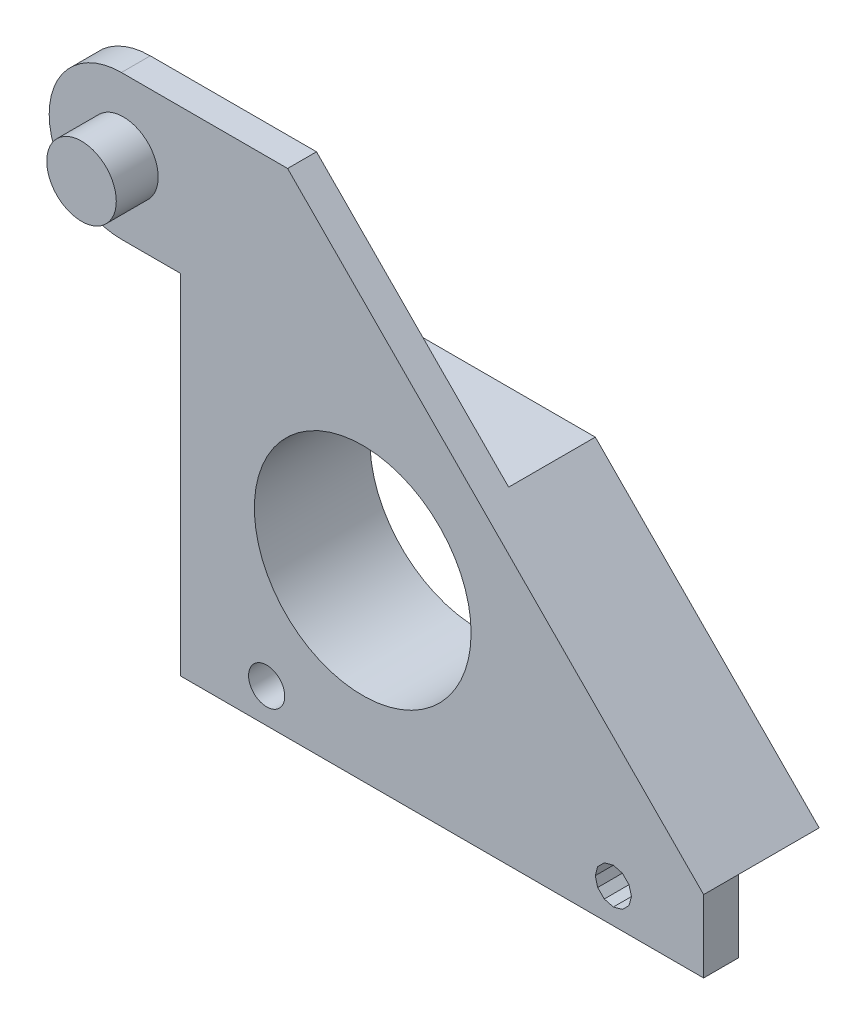
ISO-10303-21;
HEADER;
FILE_DESCRIPTION(('STEP AP214'),'2;1');
FILE_NAME('part.step','',(''),(''),'','','');
FILE_SCHEMA(('AUTOMOTIVE_DESIGN { 1 0 10303 214 1 1 1 1 }'));
ENDSEC;
DATA;
#1=APPLICATION_CONTEXT('core data for automotive mechanical design processes');
#2=APPLICATION_PROTOCOL_DEFINITION('international standard','automotive_design',2000,#1);
#3=PRODUCT_CONTEXT('',#1,'mechanical');
#4=PRODUCT('Part','Part','',(#3));
#5=PRODUCT_RELATED_PRODUCT_CATEGORY('part','',(#4));
#6=PRODUCT_DEFINITION_FORMATION('','',#4);
#7=PRODUCT_DEFINITION_CONTEXT('part definition',#1,'design');
#8=PRODUCT_DEFINITION('design','',#6,#7);
#9=PRODUCT_DEFINITION_SHAPE('','',#8);
#10=(LENGTH_UNIT() NAMED_UNIT(*) SI_UNIT(.MILLI.,.METRE.));
#11=(NAMED_UNIT(*) PLANE_ANGLE_UNIT() SI_UNIT($,.RADIAN.));
#12=(NAMED_UNIT(*) SI_UNIT($,.STERADIAN.) SOLID_ANGLE_UNIT());
#13=UNCERTAINTY_MEASURE_WITH_UNIT(LENGTH_MEASURE(1.E-05),#10,'distance_accuracy_value','');
#14=(GEOMETRIC_REPRESENTATION_CONTEXT(3) GLOBAL_UNCERTAINTY_ASSIGNED_CONTEXT((#13)) GLOBAL_UNIT_ASSIGNED_CONTEXT((#10,
#11,#12)) REPRESENTATION_CONTEXT('',''));
#15=CARTESIAN_POINT('',(0.,0.,0.));
#16=DIRECTION('',(0.,0.,1.));
#17=DIRECTION('',(1.,0.,0.));
#18=AXIS2_PLACEMENT_3D('',#15,#16,#17);
#19=CARTESIAN_POINT('',(-56.2999993562698,-5.49999997019768,0.));
#20=DIRECTION('',(-1.,0.,0.));
#21=DIRECTION('',(0.,0.,1.));
#22=AXIS2_PLACEMENT_3D('',#19,#20,#21);
#23=PLANE('',#22);
#24=DIRECTION('',(0.,0.,-1.));
#25=VECTOR('',#24,1.);
#26=CARTESIAN_POINT('',(-56.2999993562698,-8.95606280006322,0.400000113993883));
#27=LINE('',#26,#25);
#28=CARTESIAN_POINT('',(-56.2999993562698,-8.95606280006322,0.400000113993883));
#29=VERTEX_POINT('',#28);
#30=CARTESIAN_POINT('',(-56.2999993562698,-8.95606280006322,-5.59999988600612));
#31=VERTEX_POINT('',#30);
#32=EDGE_CURVE('E291',#29,#31,#27,.T.);
#33=ORIENTED_EDGE('',*,*,#32,.T.);
#34=DIRECTION('',(0.,-1.,0.));
#35=VECTOR('',#34,1.);
#36=CARTESIAN_POINT('',(-56.2999993562698,-24.6347561478615,-5.59999988600612));
#37=LINE('',#36,#35);
#38=CARTESIAN_POINT('',(-56.2999993562698,-24.6347561478615,-5.59999988600612));
#39=VERTEX_POINT('',#38);
#40=EDGE_CURVE('E285',#31,#39,#37,.T.);
#41=ORIENTED_EDGE('',*,*,#40,.T.);
#42=DIRECTION('',(0.,0.,1.));
#43=VECTOR('',#42,1.);
#44=CARTESIAN_POINT('',(-56.2999993562698,-24.6347561478615,-5.59999988600612));
#45=LINE('',#44,#43);
#46=CARTESIAN_POINT('',(-56.2999993562698,-24.6347561478615,0.));
#47=VERTEX_POINT('',#46);
#48=EDGE_CURVE('E64',#39,#47,#45,.T.);
#49=ORIENTED_EDGE('',*,*,#48,.T.);
#50=DIRECTION('',(0.,-1.,0.));
#51=VECTOR('',#50,1.);
#52=CARTESIAN_POINT('',(-56.2999993562698,-5.49999997019768,0.));
#53=LINE('',#52,#51);
#54=CARTESIAN_POINT('',(-56.2999993562698,-29.6347561478615,0.));
#55=VERTEX_POINT('',#54);
#56=EDGE_CURVE('E225',#47,#55,#53,.T.);
#57=ORIENTED_EDGE('',*,*,#56,.T.);
#58=DIRECTION('',(0.,0.,-1.));
#59=VECTOR('',#58,1.);
#60=CARTESIAN_POINT('',(-56.2999993562698,-29.6347561478615,0.));
#61=LINE('',#60,#59);
#62=CARTESIAN_POINT('',(-56.2999993562698,-29.6347561478615,2.40000011399388));
#63=VERTEX_POINT('',#62);
#64=EDGE_CURVE('E255',#63,#55,#61,.T.);
#65=ORIENTED_EDGE('',*,*,#64,.F.);
#66=DIRECTION('',(0.,-1.,0.));
#67=VECTOR('',#66,1.);
#68=CARTESIAN_POINT('',(-56.2999993562698,-5.49999997019768,2.40000011399388));
#69=LINE('',#68,#67);
#70=CARTESIAN_POINT('',(-56.2999993562698,-5.49999997019768,2.40000011399388));
#71=VERTEX_POINT('',#70);
#72=EDGE_CURVE('E231',#71,#63,#69,.T.);
#73=ORIENTED_EDGE('',*,*,#72,.F.);
#74=DIRECTION('',(0.,0.,1.));
#75=VECTOR('',#74,1.);
#76=CARTESIAN_POINT('',(-56.2999993562698,-5.49999997019768,0.));
#77=LINE('',#76,#75);
#78=CARTESIAN_POINT('',(-56.2999993562698,-5.49999997019768,0.400000113993883));
#79=VERTEX_POINT('',#78);
#80=EDGE_CURVE('E11',#79,#71,#77,.T.);
#81=ORIENTED_EDGE('',*,*,#80,.F.);
#82=DIRECTION('',(0.,1.,0.));
#83=VECTOR('',#82,1.);
#84=CARTESIAN_POINT('',(-56.2999993562698,-8.95606280006322,0.400000113993883));
#85=LINE('',#84,#83);
#86=EDGE_CURVE('E198',#29,#79,#85,.T.);
#87=ORIENTED_EDGE('',*,*,#86,.F.);
#88=EDGE_LOOP('',(#33,#41,#49,#57,#65,#73,#81,#87));
#89=FACE_BOUND('',#88,.T.);
#90=ADVANCED_FACE('F39',(#89),#23,.T.);
#91=CARTESIAN_POINT('',(-60.4056119918823,-5.49999997019768,0.));
#92=DIRECTION('',(0.,-1.,0.));
#93=DIRECTION('',(1.,0.,0.));
#94=AXIS2_PLACEMENT_3D('',#91,#92,#93);
#95=PLANE('',#94);
#96=DIRECTION('',(-1.,0.,0.));
#97=VECTOR('',#96,1.);
#98=CARTESIAN_POINT('',(-56.2999993562698,-5.49999997019768,0.400000113993883));
#99=LINE('',#98,#97);
#100=CARTESIAN_POINT('',(-60.4056119918823,-5.49999997019768,0.400000113993883));
#101=VERTEX_POINT('',#100);
#102=EDGE_CURVE('E191',#79,#101,#99,.T.);
#103=ORIENTED_EDGE('',*,*,#102,.F.);
#104=ORIENTED_EDGE('',*,*,#80,.T.);
#105=DIRECTION('',(1.,0.,0.));
#106=VECTOR('',#105,1.);
#107=CARTESIAN_POINT('',(-60.4056119918823,-5.49999997019768,2.40000011399388));
#108=LINE('',#107,#106);
#109=CARTESIAN_POINT('',(-60.4056119918823,-5.49999997019768,2.40000011399388));
#110=VERTEX_POINT('',#109);
#111=EDGE_CURVE('E215',#110,#71,#108,.T.);
#112=ORIENTED_EDGE('',*,*,#111,.F.);
#113=DIRECTION('',(0.,0.,1.));
#114=VECTOR('',#113,1.);
#115=CARTESIAN_POINT('',(-60.4056119918823,-5.49999997019768,0.));
#116=LINE('',#115,#114);
#117=EDGE_CURVE('E48',#101,#110,#116,.T.);
#118=ORIENTED_EDGE('',*,*,#117,.F.);
#119=EDGE_LOOP('',(#103,#104,#112,#118));
#120=FACE_BOUND('',#119,.T.);
#121=ADVANCED_FACE('F213',(#120),#95,.T.);
#122=CARTESIAN_POINT('',(-48.9003583788872,4.4999998062849,0.));
#123=DIRECTION('',(0.,1.,0.));
#124=DIRECTION('',(0.,0.,1.));
#125=AXIS2_PLACEMENT_3D('',#122,#123,#124);
#126=PLANE('',#125);
#127=DIRECTION('',(1.,0.,0.));
#128=VECTOR('',#127,1.);
#129=CARTESIAN_POINT('',(-48.9003583788872,4.4999998062849,0.400000113993883));
#130=LINE('',#129,#128);
#131=CARTESIAN_POINT('',(-60.4056119918823,4.4999998062849,0.400000113993883));
#132=VERTEX_POINT('',#131);
#133=CARTESIAN_POINT('',(-48.9003583788872,4.4999998062849,0.400000113993883));
#134=VERTEX_POINT('',#133);
#135=EDGE_CURVE('E210',#132,#134,#130,.T.);
#136=ORIENTED_EDGE('',*,*,#135,.F.);
#137=DIRECTION('',(0.,0.,1.));
#138=VECTOR('',#137,1.);
#139=CARTESIAN_POINT('',(-60.4056119918823,4.4999998062849,0.));
#140=LINE('',#139,#138);
#141=CARTESIAN_POINT('',(-60.4056119918823,4.4999998062849,2.40000011399388));
#142=VERTEX_POINT('',#141);
#143=EDGE_CURVE('E209',#132,#142,#140,.T.);
#144=ORIENTED_EDGE('',*,*,#143,.T.);
#145=DIRECTION('',(-1.,0.,0.));
#146=VECTOR('',#145,1.);
#147=CARTESIAN_POINT('',(-48.9003583788872,4.4999998062849,2.40000011399388));
#148=LINE('',#147,#146);
#149=CARTESIAN_POINT('',(-48.9003583788872,4.4999998062849,2.40000011399388));
#150=VERTEX_POINT('',#149);
#151=EDGE_CURVE('E243',#150,#142,#148,.T.);
#152=ORIENTED_EDGE('',*,*,#151,.F.);
#153=DIRECTION('',(0.,0.,1.));
#154=VECTOR('',#153,1.);
#155=CARTESIAN_POINT('',(-48.9003583788872,4.4999998062849,0.));
#156=LINE('',#155,#154);
#157=EDGE_CURVE('E217',#134,#150,#156,.T.);
#158=ORIENTED_EDGE('',*,*,#157,.F.);
#159=EDGE_LOOP('',(#136,#144,#152,#158));
#160=FACE_BOUND('',#159,.T.);
#161=ADVANCED_FACE('F284',(#160),#126,.T.);
#162=CARTESIAN_POINT('',(-20.1000012457371,-24.6347561478615,0.));
#163=DIRECTION('',(0.711176322679684,0.703013682697429,0.));
#164=DIRECTION('',(-0.703013682697429,0.711176322679684,0.));
#165=AXIS2_PLACEMENT_3D('',#162,#163,#164);
#166=PLANE('',#165);
#167=DIRECTION('',(0.,0.,-1.));
#168=VECTOR('',#167,1.);
#169=CARTESIAN_POINT('',(-35.5987398831366,-8.95606280006322,0.400000113993883));
#170=LINE('',#169,#168);
#171=CARTESIAN_POINT('',(-35.5987398831366,-8.95606280006322,0.400000113993883));
#172=VERTEX_POINT('',#171);
#173=CARTESIAN_POINT('',(-35.5987398831366,-8.95606280006322,-5.59999988600612));
#174=VERTEX_POINT('',#173);
#175=EDGE_CURVE('E56',#172,#174,#170,.T.);
#176=ORIENTED_EDGE('',*,*,#175,.F.);
#177=DIRECTION('',(0.703013682697429,-0.711176322679684,0.));
#178=VECTOR('',#177,1.);
#179=CARTESIAN_POINT('',(-35.5987398831366,-8.95606280006322,0.400000113993883));
#180=LINE('',#179,#178);
#181=EDGE_CURVE('E671',#134,#172,#180,.T.);
#182=ORIENTED_EDGE('',*,*,#181,.F.);
#183=ORIENTED_EDGE('',*,*,#157,.T.);
#184=DIRECTION('',(-0.703013682697429,0.711176322679684,0.));
#185=VECTOR('',#184,1.);
#186=CARTESIAN_POINT('',(-20.1000012457371,-24.6347561478615,2.40000011399388));
#187=LINE('',#186,#185);
#188=CARTESIAN_POINT('',(-20.1000012457371,-24.6347561478615,2.40000011399388));
#189=VERTEX_POINT('',#188);
#190=EDGE_CURVE('E240',#189,#150,#187,.T.);
#191=ORIENTED_EDGE('',*,*,#190,.F.);
#192=DIRECTION('',(0.,0.,1.));
#193=VECTOR('',#192,1.);
#194=CARTESIAN_POINT('',(-20.1000012457371,-24.6347561478615,0.));
#195=LINE('',#194,#193);
#196=CARTESIAN_POINT('',(-20.1000012457371,-24.6347561478615,0.));
#197=VERTEX_POINT('',#196);
#198=EDGE_CURVE('E43',#197,#189,#195,.T.);
#199=ORIENTED_EDGE('',*,*,#198,.F.);
#200=DIRECTION('',(0.,0.,1.));
#201=VECTOR('',#200,1.);
#202=CARTESIAN_POINT('',(-20.1000012457371,-24.6347561478615,-5.59999988600612));
#203=LINE('',#202,#201);
#204=CARTESIAN_POINT('',(-20.1000012457371,-24.6347561478615,-5.59999988600612));
#205=VERTEX_POINT('',#204);
#206=EDGE_CURVE('E279',#205,#197,#203,.T.);
#207=ORIENTED_EDGE('',*,*,#206,.F.);
#208=DIRECTION('',(-0.703013682697429,0.711176322679684,0.));
#209=VECTOR('',#208,1.);
#210=CARTESIAN_POINT('',(-48.9003583788872,4.4999998062849,-5.59999988600612));
#211=LINE('',#210,#209);
#212=EDGE_CURVE('E295',#205,#174,#211,.T.);
#213=ORIENTED_EDGE('',*,*,#212,.T.);
#214=EDGE_LOOP('',(#176,#182,#183,#191,#199,#207,#213));
#215=FACE_BOUND('',#214,.T.);
#216=ADVANCED_FACE('F41',(#215),#166,.T.);
#217=CARTESIAN_POINT('',(-60.2988634097059,-0.500000081956387,0.));
#218=DIRECTION('',(0.,0.,1.));
#219=DIRECTION('',(1.,0.,0.));
#220=AXIS2_PLACEMENT_3D('',#217,#218,#219);
#221=PLANE('',#220);
#222=CARTESIAN_POINT('',(-50.3500010818243,-27.2502419436914,0.));
#223=DIRECTION('',(0.,0.,-1.));
#224=DIRECTION('',(-1.,0.,0.));
#225=AXIS2_PLACEMENT_3D('',#222,#223,#224);
#226=CIRCLE('',#225,1.25275879254651);
#227=CARTESIAN_POINT('',(-51.6027598743708,-27.2502419436914,0.));
#228=VERTEX_POINT('',#227);
#229=EDGE_CURVE('E302',#228,#228,#226,.T.);
#230=ORIENTED_EDGE('',*,*,#229,.F.);
#231=EDGE_LOOP('',(#230));
#232=FACE_BOUND('',#231,.T.);
#233=DIRECTION('',(0.707105346446154,-0.70710821592403,0.));
#234=VECTOR('',#233,1.);
#235=CARTESIAN_POINT('',(-27.4349991232157,-27.8759989887476,0.));
#236=LINE('',#235,#234);
#237=CARTESIAN_POINT('',(-27.4349991232157,-27.8759989887476,0.));
#238=VERTEX_POINT('',#237);
#239=CARTESIAN_POINT('',(-26.9760005176067,-28.3349994570017,0.));
#240=VERTEX_POINT('',#239);
#241=EDGE_CURVE('E345',#238,#240,#236,.T.);
#242=ORIENTED_EDGE('',*,*,#241,.T.);
#243=DIRECTION('',(0.965823467607934,-0.259200751190628,0.));
#244=VECTOR('',#243,1.);
#245=CARTESIAN_POINT('',(-26.9760005176067,-28.3349994570017,0.));
#246=LINE('',#245,#244);
#247=CARTESIAN_POINT('',(-26.350000873208,-28.5030007362366,0.));
#248=VERTEX_POINT('',#247);
#249=EDGE_CURVE('E311',#240,#248,#246,.T.);
#250=ORIENTED_EDGE('',*,*,#249,.T.);
#251=DIRECTION('',(0.965823467607934,0.259200751190628,0.));
#252=VECTOR('',#251,1.);
#253=CARTESIAN_POINT('',(-26.350000873208,-28.5030007362366,0.));
#254=LINE('',#253,#252);
#255=CARTESIAN_POINT('',(-25.7240012288094,-28.3349994570017,0.));
#256=VERTEX_POINT('',#255);
#257=EDGE_CURVE('E314',#248,#256,#254,.T.);
#258=ORIENTED_EDGE('',*,*,#257,.T.);
#259=DIRECTION('',(0.707108215918207,0.707105346451977,0.));
#260=VECTOR('',#259,1.);
#261=CARTESIAN_POINT('',(-25.7240012288094,-28.3349994570017,0.));
#262=LINE('',#261,#260);
#263=CARTESIAN_POINT('',(-25.2649988979101,-27.8759989887476,0.));
#264=VERTEX_POINT('',#263);
#265=EDGE_CURVE('E318',#256,#264,#262,.T.);
#266=ORIENTED_EDGE('',*,*,#265,.T.);
#267=DIRECTION('',(0.25919807048093,0.965824187033522,0.));
#268=VECTOR('',#267,1.);
#269=CARTESIAN_POINT('',(-25.2649988979101,-27.8759989887476,0.));
#270=LINE('',#269,#268);
#271=CARTESIAN_POINT('',(-25.0969994813204,-27.2499993443489,0.));
#272=VERTEX_POINT('',#271);
#273=EDGE_CURVE('E321',#264,#272,#270,.T.);
#274=ORIENTED_EDGE('',*,*,#273,.T.);
#275=DIRECTION('',(-0.25919807048093,0.965824187033522,0.));
#276=VECTOR('',#275,1.);
#277=CARTESIAN_POINT('',(-25.0969994813204,-27.2499993443489,0.));
#278=LINE('',#277,#276);
#279=CARTESIAN_POINT('',(-25.2649988979101,-26.6239996999502,0.));
#280=VERTEX_POINT('',#279);
#281=EDGE_CURVE('E324',#272,#280,#278,.T.);
#282=ORIENTED_EDGE('',*,*,#281,.T.);
#283=DIRECTION('',(-0.707109650652778,0.707103911708672,0.));
#284=VECTOR('',#283,1.);
#285=CARTESIAN_POINT('',(-25.2649988979101,-26.6239996999502,0.));
#286=LINE('',#285,#284);
#287=CARTESIAN_POINT('',(-25.7240012288094,-26.1650010943413,0.));
#288=VERTEX_POINT('',#287);
#289=EDGE_CURVE('E327',#280,#288,#286,.T.);
#290=ORIENTED_EDGE('',*,*,#289,.T.);
#291=DIRECTION('',(-0.966208881366902,0.257760349099157,0.));
#292=VECTOR('',#291,1.);
#293=CARTESIAN_POINT('',(-25.7240012288094,-26.1650010943413,0.));
#294=LINE('',#293,#292);
#295=CARTESIAN_POINT('',(-26.350000873208,-25.9980000555515,0.));
#296=VERTEX_POINT('',#295);
#297=EDGE_CURVE('E330',#288,#296,#294,.T.);
#298=ORIENTED_EDGE('',*,*,#297,.T.);
#299=DIRECTION('',(-0.966208881366902,-0.257760349099157,0.));
#300=VECTOR('',#299,1.);
#301=CARTESIAN_POINT('',(-26.350000873208,-25.9980000555515,0.));
#302=LINE('',#301,#300);
#303=CARTESIAN_POINT('',(-26.9760005176067,-26.1650010943413,0.));
#304=VERTEX_POINT('',#303);
#305=EDGE_CURVE('E333',#296,#304,#302,.T.);
#306=ORIENTED_EDGE('',*,*,#305,.T.);
#307=DIRECTION('',(-0.707106781186547,-0.707106781186547,0.));
#308=VECTOR('',#307,1.);
#309=CARTESIAN_POINT('',(-26.9760005176067,-26.1650010943413,0.));
#310=LINE('',#309,#308);
#311=CARTESIAN_POINT('',(-27.4349991232157,-26.6239996999502,0.));
#312=VERTEX_POINT('',#311);
#313=EDGE_CURVE('E336',#304,#312,#310,.T.);
#314=ORIENTED_EDGE('',*,*,#313,.T.);
#315=DIRECTION('',(-0.257760349099157,-0.966208881366902,0.));
#316=VECTOR('',#315,1.);
#317=CARTESIAN_POINT('',(-27.4349991232157,-26.6239996999502,0.));
#318=LINE('',#317,#316);
#319=CARTESIAN_POINT('',(-27.6020001620054,-27.2499993443489,0.));
#320=VERTEX_POINT('',#319);
#321=EDGE_CURVE('E339',#312,#320,#318,.T.);
#322=ORIENTED_EDGE('',*,*,#321,.T.);
#323=DIRECTION('',(0.257760349099157,-0.966208881366902,0.));
#324=VECTOR('',#323,1.);
#325=CARTESIAN_POINT('',(-27.6020001620054,-27.2499993443489,0.));
#326=LINE('',#325,#324);
#327=EDGE_CURVE('E342',#320,#238,#326,.T.);
#328=ORIENTED_EDGE('',*,*,#327,.T.);
#329=EDGE_LOOP('',(#242,#250,#258,#266,#274,#282,#290,#298,#306,#314,#322,#328));
#330=FACE_BOUND('',#329,.T.);
#331=ORIENTED_EDGE('',*,*,#56,.F.);
#332=DIRECTION('',(1.,0.,0.));
#333=VECTOR('',#332,1.);
#334=CARTESIAN_POINT('',(-60.2988634097059,-24.6347561478615,0.));
#335=LINE('',#334,#333);
#336=EDGE_CURVE('E276',#47,#197,#335,.T.);
#337=ORIENTED_EDGE('',*,*,#336,.T.);
#338=DIRECTION('',(0.,1.,0.));
#339=VECTOR('',#338,1.);
#340=CARTESIAN_POINT('',(-20.1000012457371,-29.6347561478615,0.));
#341=LINE('',#340,#339);
#342=CARTESIAN_POINT('',(-20.1000012457371,-29.6347561478615,0.));
#343=VERTEX_POINT('',#342);
#344=EDGE_CURVE('E238',#343,#197,#341,.T.);
#345=ORIENTED_EDGE('',*,*,#344,.F.);
#346=DIRECTION('',(1.,0.,0.));
#347=VECTOR('',#346,1.);
#348=CARTESIAN_POINT('',(-20.1000012457371,-29.6347561478615,0.));
#349=LINE('',#348,#347);
#350=EDGE_CURVE('E257',#55,#343,#349,.T.);
#351=ORIENTED_EDGE('',*,*,#350,.F.);
#352=EDGE_LOOP('',(#331,#337,#345,#351));
#353=FACE_BOUND('',#352,.T.);
#354=ADVANCED_FACE('F275',(#232,#330,#353),#221,.F.);
#355=CARTESIAN_POINT('',(-60.2988634097059,-0.500000081956387,2.40000011399388));
#356=DIRECTION('',(0.,0.,1.));
#357=DIRECTION('',(1.,0.,0.));
#358=AXIS2_PLACEMENT_3D('',#355,#356,#357);
#359=PLANE('',#358);
#360=DIRECTION('',(0.,1.,0.));
#361=VECTOR('',#360,1.);
#362=CARTESIAN_POINT('',(-20.1000012457371,-29.6347561478615,2.40000011399388));
#363=LINE('',#362,#361);
#364=CARTESIAN_POINT('',(-20.1000012457371,-29.6347561478615,2.40000011399388));
#365=VERTEX_POINT('',#364);
#366=EDGE_CURVE('E269',#365,#189,#363,.T.);
#367=ORIENTED_EDGE('',*,*,#366,.T.);
#368=ORIENTED_EDGE('',*,*,#190,.T.);
#369=ORIENTED_EDGE('',*,*,#151,.T.);
#370=CARTESIAN_POINT('',(-60.4056119918823,-0.500000081956387,2.40000011399388));
#371=DIRECTION('',(0.,0.,1.));
#372=DIRECTION('',(-1.,0.,0.));
#373=AXIS2_PLACEMENT_3D('',#370,#371,#372);
#374=CIRCLE('',#373,4.99999988824129);
#375=EDGE_CURVE('E252',#142,#110,#374,.T.);
#376=ORIENTED_EDGE('',*,*,#375,.T.);
#377=ORIENTED_EDGE('',*,*,#111,.T.);
#378=ORIENTED_EDGE('',*,*,#72,.T.);
#379=DIRECTION('',(-1.,0.,0.));
#380=VECTOR('',#379,1.);
#381=CARTESIAN_POINT('',(-56.2999993562698,-29.6347561478615,2.40000011399388));
#382=LINE('',#381,#380);
#383=EDGE_CURVE('E268',#365,#63,#382,.T.);
#384=ORIENTED_EDGE('',*,*,#383,.F.);
#385=EDGE_LOOP('',(#367,#368,#369,#376,#377,#378,#384));
#386=FACE_BOUND('',#385,.T.);
#387=CARTESIAN_POINT('',(-50.3500010818243,-27.2502419436914,2.40000011399388));
#388=DIRECTION('',(0.,0.,-1.));
#389=DIRECTION('',(-1.,0.,0.));
#390=AXIS2_PLACEMENT_3D('',#387,#388,#389);
#391=CIRCLE('',#390,1.25275879254651);
#392=CARTESIAN_POINT('',(-51.6027598743708,-27.2502419436914,2.40000011399388));
#393=VERTEX_POINT('',#392);
#394=EDGE_CURVE('E305',#393,#393,#391,.T.);
#395=ORIENTED_EDGE('',*,*,#394,.T.);
#396=EDGE_LOOP('',(#395));
#397=FACE_BOUND('',#396,.T.);
#398=DIRECTION('',(0.965823467607934,-0.259200751190628,0.));
#399=VECTOR('',#398,1.);
#400=CARTESIAN_POINT('',(-26.9760005176067,-28.3349994570017,2.40000011399388));
#401=LINE('',#400,#399);
#402=CARTESIAN_POINT('',(-26.9760005176067,-28.3349994570017,2.40000011399388));
#403=VERTEX_POINT('',#402);
#404=CARTESIAN_POINT('',(-26.350000873208,-28.5030007362366,2.40000011399388));
#405=VERTEX_POINT('',#404);
#406=EDGE_CURVE('E308',#403,#405,#401,.T.);
#407=ORIENTED_EDGE('',*,*,#406,.F.);
#408=DIRECTION('',(0.707105346446154,-0.70710821592403,0.));
#409=VECTOR('',#408,1.);
#410=CARTESIAN_POINT('',(-27.4349991232157,-27.8759989887476,2.40000011399388));
#411=LINE('',#410,#409);
#412=CARTESIAN_POINT('',(-27.4349991232157,-27.8759989887476,2.40000011399388));
#413=VERTEX_POINT('',#412);
#414=EDGE_CURVE('E315',#413,#403,#411,.T.);
#415=ORIENTED_EDGE('',*,*,#414,.F.);
#416=DIRECTION('',(0.257760349099157,-0.966208881366902,0.));
#417=VECTOR('',#416,1.);
#418=CARTESIAN_POINT('',(-27.6020001620054,-27.2499993443489,2.40000011399388));
#419=LINE('',#418,#417);
#420=CARTESIAN_POINT('',(-27.6020001620054,-27.2499993443489,2.40000011399388));
#421=VERTEX_POINT('',#420);
#422=EDGE_CURVE('E377',#421,#413,#419,.T.);
#423=ORIENTED_EDGE('',*,*,#422,.F.);
#424=DIRECTION('',(-0.257760349099157,-0.966208881366902,0.));
#425=VECTOR('',#424,1.);
#426=CARTESIAN_POINT('',(-27.4349991232157,-26.6239996999502,2.40000011399388));
#427=LINE('',#426,#425);
#428=CARTESIAN_POINT('',(-27.4349991232157,-26.6239996999502,2.40000011399388));
#429=VERTEX_POINT('',#428);
#430=EDGE_CURVE('E374',#429,#421,#427,.T.);
#431=ORIENTED_EDGE('',*,*,#430,.F.);
#432=DIRECTION('',(-0.707106781186547,-0.707106781186547,0.));
#433=VECTOR('',#432,1.);
#434=CARTESIAN_POINT('',(-26.9760005176067,-26.1650010943413,2.40000011399388));
#435=LINE('',#434,#433);
#436=CARTESIAN_POINT('',(-26.9760005176067,-26.1650010943413,2.40000011399388));
#437=VERTEX_POINT('',#436);
#438=EDGE_CURVE('E371',#437,#429,#435,.T.);
#439=ORIENTED_EDGE('',*,*,#438,.F.);
#440=DIRECTION('',(-0.966208881366902,-0.257760349099157,0.));
#441=VECTOR('',#440,1.);
#442=CARTESIAN_POINT('',(-26.350000873208,-25.9980000555515,2.40000011399388));
#443=LINE('',#442,#441);
#444=CARTESIAN_POINT('',(-26.350000873208,-25.9980000555515,2.40000011399388));
#445=VERTEX_POINT('',#444);
#446=EDGE_CURVE('E368',#445,#437,#443,.T.);
#447=ORIENTED_EDGE('',*,*,#446,.F.);
#448=DIRECTION('',(-0.966208881366902,0.257760349099157,0.));
#449=VECTOR('',#448,1.);
#450=CARTESIAN_POINT('',(-25.7240012288094,-26.1650010943413,2.40000011399388));
#451=LINE('',#450,#449);
#452=CARTESIAN_POINT('',(-25.7240012288094,-26.1650010943413,2.40000011399388));
#453=VERTEX_POINT('',#452);
#454=EDGE_CURVE('E365',#453,#445,#451,.T.);
#455=ORIENTED_EDGE('',*,*,#454,.F.);
#456=DIRECTION('',(-0.707109650652778,0.707103911708672,0.));
#457=VECTOR('',#456,1.);
#458=CARTESIAN_POINT('',(-25.2649988979101,-26.6239996999502,2.40000011399388));
#459=LINE('',#458,#457);
#460=CARTESIAN_POINT('',(-25.2649988979101,-26.6239996999502,2.40000011399388));
#461=VERTEX_POINT('',#460);
#462=EDGE_CURVE('E362',#461,#453,#459,.T.);
#463=ORIENTED_EDGE('',*,*,#462,.F.);
#464=DIRECTION('',(-0.25919807048093,0.965824187033522,0.));
#465=VECTOR('',#464,1.);
#466=CARTESIAN_POINT('',(-25.0969994813204,-27.2499993443489,2.40000011399388));
#467=LINE('',#466,#465);
#468=CARTESIAN_POINT('',(-25.0969994813204,-27.2499993443489,2.40000011399388));
#469=VERTEX_POINT('',#468);
#470=EDGE_CURVE('E359',#469,#461,#467,.T.);
#471=ORIENTED_EDGE('',*,*,#470,.F.);
#472=DIRECTION('',(0.25919807048093,0.965824187033522,0.));
#473=VECTOR('',#472,1.);
#474=CARTESIAN_POINT('',(-25.2649988979101,-27.8759989887476,2.40000011399388));
#475=LINE('',#474,#473);
#476=CARTESIAN_POINT('',(-25.2649988979101,-27.8759989887476,2.40000011399388));
#477=VERTEX_POINT('',#476);
#478=EDGE_CURVE('E356',#477,#469,#475,.T.);
#479=ORIENTED_EDGE('',*,*,#478,.F.);
#480=DIRECTION('',(0.707108215918207,0.707105346451977,0.));
#481=VECTOR('',#480,1.);
#482=CARTESIAN_POINT('',(-25.7240012288094,-28.3349994570017,2.40000011399388));
#483=LINE('',#482,#481);
#484=CARTESIAN_POINT('',(-25.7240012288094,-28.3349994570017,2.40000011399388));
#485=VERTEX_POINT('',#484);
#486=EDGE_CURVE('E353',#485,#477,#483,.T.);
#487=ORIENTED_EDGE('',*,*,#486,.F.);
#488=DIRECTION('',(0.965823467607934,0.259200751190628,0.));
#489=VECTOR('',#488,1.);
#490=CARTESIAN_POINT('',(-26.350000873208,-28.5030007362366,2.40000011399388));
#491=LINE('',#490,#489);
#492=EDGE_CURVE('E350',#405,#485,#491,.T.);
#493=ORIENTED_EDGE('',*,*,#492,.F.);
#494=EDGE_LOOP('',(#407,#415,#423,#431,#439,#447,#455,#463,#471,#479,#487,#493));
#495=FACE_BOUND('',#494,.T.);
#496=CARTESIAN_POINT('',(-43.7000021338463,-16.9999397938725,2.40000011399388));
#497=DIRECTION('',(0.,0.,1.));
#498=DIRECTION('',(1.,0.,0.));
#499=AXIS2_PLACEMENT_3D('',#496,#497,#498);
#500=CIRCLE('',#499,7.50228960936678);
#501=CARTESIAN_POINT('',(-36.1977125244795,-16.9999397938725,2.40000011399388));
#502=VERTEX_POINT('',#501);
#503=EDGE_CURVE('E258',#502,#502,#500,.T.);
#504=ORIENTED_EDGE('',*,*,#503,.F.);
#505=EDGE_LOOP('',(#504));
#506=FACE_BOUND('',#505,.T.);
#507=CARTESIAN_POINT('',(-60.2677280873279,-0.499100599907389,2.40000011399388));
#508=DIRECTION('',(0.,0.,1.));
#509=DIRECTION('',(1.,0.,0.));
#510=AXIS2_PLACEMENT_3D('',#507,#508,#509);
#511=CIRCLE('',#510,2.40696441159928);
#512=CARTESIAN_POINT('',(-57.8607636757286,-0.499100599907389,2.40000011399388));
#513=VERTEX_POINT('',#512);
#514=EDGE_CURVE('E278',#513,#513,#511,.T.);
#515=ORIENTED_EDGE('',*,*,#514,.F.);
#516=EDGE_LOOP('',(#515));
#517=FACE_BOUND('',#516,.T.);
#518=ADVANCED_FACE('F248',(#386,#397,#495,#506,#517),#359,.T.);
#519=CARTESIAN_POINT('',(-20.1000012457371,-29.6347561478615,2.40000011399388));
#520=DIRECTION('',(-1.,0.,0.));
#521=DIRECTION('',(0.,0.,1.));
#522=AXIS2_PLACEMENT_3D('',#519,#520,#521);
#523=PLANE('',#522);
#524=ORIENTED_EDGE('',*,*,#198,.T.);
#525=ORIENTED_EDGE('',*,*,#366,.F.);
#526=DIRECTION('',(0.,0.,1.));
#527=VECTOR('',#526,1.);
#528=CARTESIAN_POINT('',(-20.1000012457371,-29.6347561478615,2.40000011399388));
#529=LINE('',#528,#527);
#530=EDGE_CURVE('E260',#343,#365,#529,.T.);
#531=ORIENTED_EDGE('',*,*,#530,.F.);
#532=ORIENTED_EDGE('',*,*,#344,.T.);
#533=EDGE_LOOP('',(#524,#525,#531,#532));
#534=FACE_BOUND('',#533,.T.);
#535=ADVANCED_FACE('F272',(#534),#523,.F.);
#536=CARTESIAN_POINT('',(0.,-29.6347561478615,0.));
#537=DIRECTION('',(0.,1.,0.));
#538=DIRECTION('',(0.,0.,1.));
#539=AXIS2_PLACEMENT_3D('',#536,#537,#538);
#540=PLANE('',#539);
#541=ORIENTED_EDGE('',*,*,#64,.T.);
#542=ORIENTED_EDGE('',*,*,#350,.T.);
#543=ORIENTED_EDGE('',*,*,#530,.T.);
#544=ORIENTED_EDGE('',*,*,#383,.T.);
#545=EDGE_LOOP('',(#541,#542,#543,#544));
#546=FACE_BOUND('',#545,.T.);
#547=ADVANCED_FACE('F488',(#546),#540,.F.);
#548=CARTESIAN_POINT('',(-43.7000021338463,-16.9999397938725,0.));
#549=DIRECTION('',(0.,0.,1.));
#550=DIRECTION('',(1.,0.,0.));
#551=AXIS2_PLACEMENT_3D('',#548,#549,#550);
#552=CYLINDRICAL_SURFACE('',#551,7.50228960936678);
#553=ORIENTED_EDGE('',*,*,#503,.T.);
#554=EDGE_LOOP('',(#553));
#555=FACE_BOUND('',#554,.T.);
#556=CARTESIAN_POINT('',(-43.7000021338463,-16.9999397938725,-5.59999988600612));
#557=DIRECTION('',(0.,0.,1.));
#558=DIRECTION('',(1.,0.,0.));
#559=AXIS2_PLACEMENT_3D('',#556,#557,#558);
#560=CIRCLE('',#559,7.50228960936678);
#561=CARTESIAN_POINT('',(-36.1977125244795,-16.9999397938725,-5.59999988600612));
#562=VERTEX_POINT('',#561);
#563=EDGE_CURVE('E286',#562,#562,#560,.T.);
#564=ORIENTED_EDGE('',*,*,#563,.F.);
#565=EDGE_LOOP('',(#564));
#566=FACE_BOUND('',#565,.T.);
#567=ADVANCED_FACE('F491',(#555,#566),#552,.F.);
#568=CARTESIAN_POINT('',(-26.9760005176067,-28.3349994570017,0.));
#569=DIRECTION('',(-0.259200751190628,-0.965823467607934,0.));
#570=DIRECTION('',(0.965823467607934,-0.259200751190628,0.));
#571=AXIS2_PLACEMENT_3D('',#568,#569,#570);
#572=PLANE('',#571);
#573=ORIENTED_EDGE('',*,*,#406,.T.);
#574=DIRECTION('',(0.,0.,1.));
#575=VECTOR('',#574,1.);
#576=CARTESIAN_POINT('',(-26.350000873208,-28.5030007362366,0.));
#577=LINE('',#576,#575);
#578=EDGE_CURVE('E348',#248,#405,#577,.T.);
#579=ORIENTED_EDGE('',*,*,#578,.F.);
#580=ORIENTED_EDGE('',*,*,#249,.F.);
#581=DIRECTION('',(0.,0.,1.));
#582=VECTOR('',#581,1.);
#583=CARTESIAN_POINT('',(-26.9760005176067,-28.3349994570017,0.));
#584=LINE('',#583,#582);
#585=EDGE_CURVE('E263',#240,#403,#584,.T.);
#586=ORIENTED_EDGE('',*,*,#585,.T.);
#587=EDGE_LOOP('',(#573,#579,#580,#586));
#588=FACE_BOUND('',#587,.T.);
#589=ADVANCED_FACE('F422',(#588),#572,.F.);
#590=CARTESIAN_POINT('',(-27.4349991232157,-27.8759989887476,0.));
#591=DIRECTION('',(-0.70710821592403,-0.707105346446154,0.));
#592=DIRECTION('',(0.707105346446154,-0.70710821592403,0.));
#593=AXIS2_PLACEMENT_3D('',#590,#591,#592);
#594=PLANE('',#593);
#595=ORIENTED_EDGE('',*,*,#414,.T.);
#596=ORIENTED_EDGE('',*,*,#585,.F.);
#597=ORIENTED_EDGE('',*,*,#241,.F.);
#598=DIRECTION('',(0.,0.,1.));
#599=VECTOR('',#598,1.);
#600=CARTESIAN_POINT('',(-27.4349991232157,-27.8759989887476,0.));
#601=LINE('',#600,#599);
#602=EDGE_CURVE('E383',#238,#413,#601,.T.);
#603=ORIENTED_EDGE('',*,*,#602,.T.);
#604=EDGE_LOOP('',(#595,#596,#597,#603));
#605=FACE_BOUND('',#604,.T.);
#606=ADVANCED_FACE('F424',(#605),#594,.F.);
#607=CARTESIAN_POINT('',(-27.6020001620054,-27.2499993443489,0.));
#608=DIRECTION('',(-0.966208881366902,-0.257760349099157,0.));
#609=DIRECTION('',(0.257760349099157,-0.966208881366903,0.));
#610=AXIS2_PLACEMENT_3D('',#607,#608,#609);
#611=PLANE('',#610);
#612=ORIENTED_EDGE('',*,*,#422,.T.);
#613=ORIENTED_EDGE('',*,*,#602,.F.);
#614=ORIENTED_EDGE('',*,*,#327,.F.);
#615=DIRECTION('',(0.,0.,1.));
#616=VECTOR('',#615,1.);
#617=CARTESIAN_POINT('',(-27.6020001620054,-27.2499993443489,0.));
#618=LINE('',#617,#616);
#619=EDGE_CURVE('E385',#320,#421,#618,.T.);
#620=ORIENTED_EDGE('',*,*,#619,.T.);
#621=EDGE_LOOP('',(#612,#613,#614,#620));
#622=FACE_BOUND('',#621,.T.);
#623=ADVANCED_FACE('F429',(#622),#611,.F.);
#624=CARTESIAN_POINT('',(-27.4349991232157,-26.6239996999502,0.));
#625=DIRECTION('',(-0.966208881366902,0.257760349099157,0.));
#626=DIRECTION('',(-0.257760349099157,-0.966208881366903,0.));
#627=AXIS2_PLACEMENT_3D('',#624,#625,#626);
#628=PLANE('',#627);
#629=ORIENTED_EDGE('',*,*,#430,.T.);
#630=ORIENTED_EDGE('',*,*,#619,.F.);
#631=ORIENTED_EDGE('',*,*,#321,.F.);
#632=DIRECTION('',(0.,0.,1.));
#633=VECTOR('',#632,1.);
#634=CARTESIAN_POINT('',(-27.4349991232157,-26.6239996999502,0.));
#635=LINE('',#634,#633);
#636=EDGE_CURVE('E387',#312,#429,#635,.T.);
#637=ORIENTED_EDGE('',*,*,#636,.T.);
#638=EDGE_LOOP('',(#629,#630,#631,#637));
#639=FACE_BOUND('',#638,.T.);
#640=ADVANCED_FACE('F433',(#639),#628,.F.);
#641=CARTESIAN_POINT('',(-26.9760005176067,-26.1650010943413,0.));
#642=DIRECTION('',(-0.707106781186547,0.707106781186547,0.));
#643=DIRECTION('',(-0.707106781186548,-0.707106781186548,0.));
#644=AXIS2_PLACEMENT_3D('',#641,#642,#643);
#645=PLANE('',#644);
#646=ORIENTED_EDGE('',*,*,#438,.T.);
#647=ORIENTED_EDGE('',*,*,#636,.F.);
#648=ORIENTED_EDGE('',*,*,#313,.F.);
#649=DIRECTION('',(0.,0.,1.));
#650=VECTOR('',#649,1.);
#651=CARTESIAN_POINT('',(-26.9760005176067,-26.1650010943413,0.));
#652=LINE('',#651,#650);
#653=EDGE_CURVE('E389',#304,#437,#652,.T.);
#654=ORIENTED_EDGE('',*,*,#653,.T.);
#655=EDGE_LOOP('',(#646,#647,#648,#654));
#656=FACE_BOUND('',#655,.T.);
#657=ADVANCED_FACE('F436',(#656),#645,.F.);
#658=CARTESIAN_POINT('',(-26.350000873208,-25.9980000555515,0.));
#659=DIRECTION('',(-0.257760349099157,0.966208881366902,0.));
#660=DIRECTION('',(-0.966208881366903,-0.257760349099157,0.));
#661=AXIS2_PLACEMENT_3D('',#658,#659,#660);
#662=PLANE('',#661);
#663=ORIENTED_EDGE('',*,*,#446,.T.);
#664=ORIENTED_EDGE('',*,*,#653,.F.);
#665=ORIENTED_EDGE('',*,*,#305,.F.);
#666=DIRECTION('',(0.,0.,1.));
#667=VECTOR('',#666,1.);
#668=CARTESIAN_POINT('',(-26.350000873208,-25.9980000555515,0.));
#669=LINE('',#668,#667);
#670=EDGE_CURVE('E391',#296,#445,#669,.T.);
#671=ORIENTED_EDGE('',*,*,#670,.T.);
#672=EDGE_LOOP('',(#663,#664,#665,#671));
#673=FACE_BOUND('',#672,.T.);
#674=ADVANCED_FACE('F441',(#673),#662,.F.);
#675=CARTESIAN_POINT('',(-25.7240012288094,-26.1650010943413,0.));
#676=DIRECTION('',(0.257760349099157,0.966208881366902,0.));
#677=DIRECTION('',(-0.966208881366903,0.257760349099157,0.));
#678=AXIS2_PLACEMENT_3D('',#675,#676,#677);
#679=PLANE('',#678);
#680=ORIENTED_EDGE('',*,*,#454,.T.);
#681=ORIENTED_EDGE('',*,*,#670,.F.);
#682=ORIENTED_EDGE('',*,*,#297,.F.);
#683=DIRECTION('',(0.,0.,1.));
#684=VECTOR('',#683,1.);
#685=CARTESIAN_POINT('',(-25.7240012288094,-26.1650010943413,0.));
#686=LINE('',#685,#684);
#687=EDGE_CURVE('E393',#288,#453,#686,.T.);
#688=ORIENTED_EDGE('',*,*,#687,.T.);
#689=EDGE_LOOP('',(#680,#681,#682,#688));
#690=FACE_BOUND('',#689,.T.);
#691=ADVANCED_FACE('F445',(#690),#679,.F.);
#692=CARTESIAN_POINT('',(-25.2649988979101,-26.6239996999502,0.));
#693=DIRECTION('',(0.707103911708672,0.707109650652778,0.));
#694=DIRECTION('',(-0.707109650652778,0.707103911708672,0.));
#695=AXIS2_PLACEMENT_3D('',#692,#693,#694);
#696=PLANE('',#695);
#697=ORIENTED_EDGE('',*,*,#462,.T.);
#698=ORIENTED_EDGE('',*,*,#687,.F.);
#699=ORIENTED_EDGE('',*,*,#289,.F.);
#700=DIRECTION('',(0.,0.,1.));
#701=VECTOR('',#700,1.);
#702=CARTESIAN_POINT('',(-25.2649988979101,-26.6239996999502,0.));
#703=LINE('',#702,#701);
#704=EDGE_CURVE('E395',#280,#461,#703,.T.);
#705=ORIENTED_EDGE('',*,*,#704,.T.);
#706=EDGE_LOOP('',(#697,#698,#699,#705));
#707=FACE_BOUND('',#706,.T.);
#708=ADVANCED_FACE('F448',(#707),#696,.F.);
#709=CARTESIAN_POINT('',(-25.0969994813204,-27.2499993443489,0.));
#710=DIRECTION('',(0.965824187033522,0.25919807048093,0.));
#711=DIRECTION('',(-0.25919807048093,0.965824187033522,0.));
#712=AXIS2_PLACEMENT_3D('',#709,#710,#711);
#713=PLANE('',#712);
#714=ORIENTED_EDGE('',*,*,#470,.T.);
#715=ORIENTED_EDGE('',*,*,#704,.F.);
#716=ORIENTED_EDGE('',*,*,#281,.F.);
#717=DIRECTION('',(0.,0.,1.));
#718=VECTOR('',#717,1.);
#719=CARTESIAN_POINT('',(-25.0969994813204,-27.2499993443489,0.));
#720=LINE('',#719,#718);
#721=EDGE_CURVE('E397',#272,#469,#720,.T.);
#722=ORIENTED_EDGE('',*,*,#721,.T.);
#723=EDGE_LOOP('',(#714,#715,#716,#722));
#724=FACE_BOUND('',#723,.T.);
#725=ADVANCED_FACE('F450',(#724),#713,.F.);
#726=CARTESIAN_POINT('',(-25.2649988979101,-27.8759989887476,0.));
#727=DIRECTION('',(0.965824187033522,-0.25919807048093,0.));
#728=DIRECTION('',(0.25919807048093,0.965824187033522,0.));
#729=AXIS2_PLACEMENT_3D('',#726,#727,#728);
#730=PLANE('',#729);
#731=ORIENTED_EDGE('',*,*,#478,.T.);
#732=ORIENTED_EDGE('',*,*,#721,.F.);
#733=ORIENTED_EDGE('',*,*,#273,.F.);
#734=DIRECTION('',(0.,0.,1.));
#735=VECTOR('',#734,1.);
#736=CARTESIAN_POINT('',(-25.2649988979101,-27.8759989887476,0.));
#737=LINE('',#736,#735);
#738=EDGE_CURVE('E399',#264,#477,#737,.T.);
#739=ORIENTED_EDGE('',*,*,#738,.T.);
#740=EDGE_LOOP('',(#731,#732,#733,#739));
#741=FACE_BOUND('',#740,.T.);
#742=ADVANCED_FACE('F453',(#741),#730,.F.);
#743=CARTESIAN_POINT('',(-25.7240012288094,-28.3349994570017,0.));
#744=DIRECTION('',(0.707105346451977,-0.707108215918207,0.));
#745=DIRECTION('',(0.707108215918207,0.707105346451977,0.));
#746=AXIS2_PLACEMENT_3D('',#743,#744,#745);
#747=PLANE('',#746);
#748=ORIENTED_EDGE('',*,*,#486,.T.);
#749=ORIENTED_EDGE('',*,*,#738,.F.);
#750=ORIENTED_EDGE('',*,*,#265,.F.);
#751=DIRECTION('',(0.,0.,1.));
#752=VECTOR('',#751,1.);
#753=CARTESIAN_POINT('',(-25.7240012288094,-28.3349994570017,0.));
#754=LINE('',#753,#752);
#755=EDGE_CURVE('E401',#256,#485,#754,.T.);
#756=ORIENTED_EDGE('',*,*,#755,.T.);
#757=EDGE_LOOP('',(#748,#749,#750,#756));
#758=FACE_BOUND('',#757,.T.);
#759=ADVANCED_FACE('F418',(#758),#747,.F.);
#760=CARTESIAN_POINT('',(-26.350000873208,-28.5030007362366,0.));
#761=DIRECTION('',(0.259200751190628,-0.965823467607934,0.));
#762=DIRECTION('',(0.965823467607934,0.259200751190628,0.));
#763=AXIS2_PLACEMENT_3D('',#760,#761,#762);
#764=PLANE('',#763);
#765=ORIENTED_EDGE('',*,*,#492,.T.);
#766=ORIENTED_EDGE('',*,*,#755,.F.);
#767=ORIENTED_EDGE('',*,*,#257,.F.);
#768=ORIENTED_EDGE('',*,*,#578,.T.);
#769=EDGE_LOOP('',(#765,#766,#767,#768));
#770=FACE_BOUND('',#769,.T.);
#771=ADVANCED_FACE('F406',(#770),#764,.F.);
#772=CARTESIAN_POINT('',(-50.3500010818243,-27.2502419436914,2.40000011399388));
#773=DIRECTION('',(0.,0.,-1.));
#774=DIRECTION('',(-1.,0.,0.));
#775=AXIS2_PLACEMENT_3D('',#772,#773,#774);
#776=CYLINDRICAL_SURFACE('',#775,1.25275879254651);
#777=ORIENTED_EDGE('',*,*,#394,.F.);
#778=EDGE_LOOP('',(#777));
#779=FACE_BOUND('',#778,.T.);
#780=ORIENTED_EDGE('',*,*,#229,.T.);
#781=EDGE_LOOP('',(#780));
#782=FACE_BOUND('',#781,.T.);
#783=ADVANCED_FACE('F498',(#779,#782),#776,.F.);
#784=CARTESIAN_POINT('',(-60.2677280873279,-0.499100599907389,5.30000011399388));
#785=DIRECTION('',(0.,0.,-1.));
#786=DIRECTION('',(-1.,0.,0.));
#787=AXIS2_PLACEMENT_3D('',#784,#785,#786);
#788=CYLINDRICAL_SURFACE('',#787,2.40696441159928);
#789=CARTESIAN_POINT('',(-60.2677280873279,-0.499100599907389,5.30000011399388));
#790=DIRECTION('',(0.,0.,1.));
#791=DIRECTION('',(1.,0.,0.));
#792=AXIS2_PLACEMENT_3D('',#789,#790,#791);
#793=CIRCLE('',#792,2.40696441159928);
#794=CARTESIAN_POINT('',(-57.8607636757286,-0.499100599907389,5.30000011399388));
#795=VERTEX_POINT('',#794);
#796=EDGE_CURVE('E299',#795,#795,#793,.T.);
#797=ORIENTED_EDGE('',*,*,#796,.F.);
#798=EDGE_LOOP('',(#797));
#799=FACE_BOUND('',#798,.T.);
#800=ORIENTED_EDGE('',*,*,#514,.T.);
#801=EDGE_LOOP('',(#800));
#802=FACE_BOUND('',#801,.T.);
#803=ADVANCED_FACE('F502',(#799,#802),#788,.T.);
#804=CARTESIAN_POINT('',(-60.2677280873279,-0.499100599907389,5.30000011399388));
#805=DIRECTION('',(0.,0.,1.));
#806=DIRECTION('',(1.,0.,0.));
#807=AXIS2_PLACEMENT_3D('',#804,#805,#806);
#808=PLANE('',#807);
#809=ORIENTED_EDGE('',*,*,#796,.T.);
#810=EDGE_LOOP('',(#809));
#811=FACE_BOUND('',#810,.T.);
#812=ADVANCED_FACE('F508',(#811),#808,.T.);
#813=CARTESIAN_POINT('',(-20.1000012457371,-24.6347561478615,-5.59999988600612));
#814=DIRECTION('',(0.,-1.,0.));
#815=DIRECTION('',(0.,0.,-1.));
#816=AXIS2_PLACEMENT_3D('',#813,#814,#815);
#817=PLANE('',#816);
#818=ORIENTED_EDGE('',*,*,#336,.F.);
#819=ORIENTED_EDGE('',*,*,#48,.F.);
#820=DIRECTION('',(1.,0.,0.));
#821=VECTOR('',#820,1.);
#822=CARTESIAN_POINT('',(-20.1000012457371,-24.6347561478615,-5.59999988600612));
#823=LINE('',#822,#821);
#824=EDGE_CURVE('E288',#39,#205,#823,.T.);
#825=ORIENTED_EDGE('',*,*,#824,.T.);
#826=ORIENTED_EDGE('',*,*,#206,.T.);
#827=EDGE_LOOP('',(#818,#819,#825,#826));
#828=FACE_BOUND('',#827,.T.);
#829=ADVANCED_FACE('F569',(#828),#817,.T.);
#830=CARTESIAN_POINT('',(-60.4056119918823,-0.500000081956387,-5.59999988600612));
#831=DIRECTION('',(0.,0.,1.));
#832=DIRECTION('',(1.,0.,0.));
#833=AXIS2_PLACEMENT_3D('',#830,#831,#832);
#834=CYLINDRICAL_SURFACE('',#833,4.99999988824129);
#835=CARTESIAN_POINT('',(-60.4056119918823,-0.500000081956387,0.400000113993883));
#836=DIRECTION('',(0.,0.,-1.));
#837=DIRECTION('',(1.,0.,0.));
#838=AXIS2_PLACEMENT_3D('',#835,#836,#837);
#839=CIRCLE('',#838,4.99999988824129);
#840=EDGE_CURVE('E194',#101,#132,#839,.T.);
#841=ORIENTED_EDGE('',*,*,#840,.F.);
#842=ORIENTED_EDGE('',*,*,#117,.T.);
#843=ORIENTED_EDGE('',*,*,#375,.F.);
#844=ORIENTED_EDGE('',*,*,#143,.F.);
#845=EDGE_LOOP('',(#841,#842,#843,#844));
#846=FACE_BOUND('',#845,.T.);
#847=ADVANCED_FACE('F206',(#846),#834,.T.);
#848=CARTESIAN_POINT('',(-60.4056119918823,-0.500000081956387,-5.59999988600612));
#849=DIRECTION('',(0.,0.,-1.));
#850=DIRECTION('',(-1.,0.,0.));
#851=AXIS2_PLACEMENT_3D('',#848,#849,#850);
#852=PLANE('',#851);
#853=DIRECTION('',(-1.,0.,0.));
#854=VECTOR('',#853,1.);
#855=CARTESIAN_POINT('',(-35.5987398831366,-8.95606280006322,-5.59999988600612));
#856=LINE('',#855,#854);
#857=EDGE_CURVE('E202',#174,#31,#856,.T.);
#858=ORIENTED_EDGE('',*,*,#857,.F.);
#859=ORIENTED_EDGE('',*,*,#212,.F.);
#860=ORIENTED_EDGE('',*,*,#824,.F.);
#861=ORIENTED_EDGE('',*,*,#40,.F.);
#862=EDGE_LOOP('',(#858,#859,#860,#861));
#863=FACE_BOUND('',#862,.T.);
#864=ORIENTED_EDGE('',*,*,#563,.T.);
#865=EDGE_LOOP('',(#864));
#866=FACE_BOUND('',#865,.T.);
#867=ADVANCED_FACE('F628',(#863,#866),#852,.T.);
#868=CARTESIAN_POINT('',(-35.5987398831366,-8.95606280006322,0.400000113993883));
#869=DIRECTION('',(0.,-1.,0.));
#870=DIRECTION('',(0.,0.,-1.));
#871=AXIS2_PLACEMENT_3D('',#868,#869,#870);
#872=PLANE('',#871);
#873=ORIENTED_EDGE('',*,*,#857,.T.);
#874=ORIENTED_EDGE('',*,*,#32,.F.);
#875=DIRECTION('',(-1.,0.,0.));
#876=VECTOR('',#875,1.);
#877=CARTESIAN_POINT('',(-35.5987398831366,-8.95606280006322,0.400000113993883));
#878=LINE('',#877,#876);
#879=EDGE_CURVE('E669',#172,#29,#878,.T.);
#880=ORIENTED_EDGE('',*,*,#879,.F.);
#881=ORIENTED_EDGE('',*,*,#175,.T.);
#882=EDGE_LOOP('',(#873,#874,#880,#881));
#883=FACE_BOUND('',#882,.T.);
#884=ADVANCED_FACE('F637',(#883),#872,.F.);
#885=CARTESIAN_POINT('',(-60.4056119918823,-0.500000081956387,0.400000113993883));
#886=DIRECTION('',(0.,0.,1.));
#887=DIRECTION('',(1.,0.,0.));
#888=AXIS2_PLACEMENT_3D('',#885,#886,#887);
#889=PLANE('',#888);
#890=ORIENTED_EDGE('',*,*,#102,.T.);
#891=ORIENTED_EDGE('',*,*,#840,.T.);
#892=ORIENTED_EDGE('',*,*,#135,.T.);
#893=ORIENTED_EDGE('',*,*,#181,.T.);
#894=ORIENTED_EDGE('',*,*,#879,.T.);
#895=ORIENTED_EDGE('',*,*,#86,.T.);
#896=EDGE_LOOP('',(#890,#891,#892,#893,#894,#895));
#897=FACE_BOUND('',#896,.T.);
#898=ADVANCED_FACE('F193',(#897),#889,.F.);
#899=CLOSED_SHELL('',(#90,#121,#161,#216,#354,#518,#535,#547,#567,#589,#606,#623,#640,#657,#674,
#691,#708,#725,#742,#759,#771,#783,#803,#812,#829,#847,#867,#884,#898));
#900=MANIFOLD_SOLID_BREP('B2',#899);
#901=ADVANCED_BREP_SHAPE_REPRESENTATION('',(#18,#900),#14);
#902=SHAPE_DEFINITION_REPRESENTATION(#9,#901);
ENDSEC;
END-ISO-10303-21;
